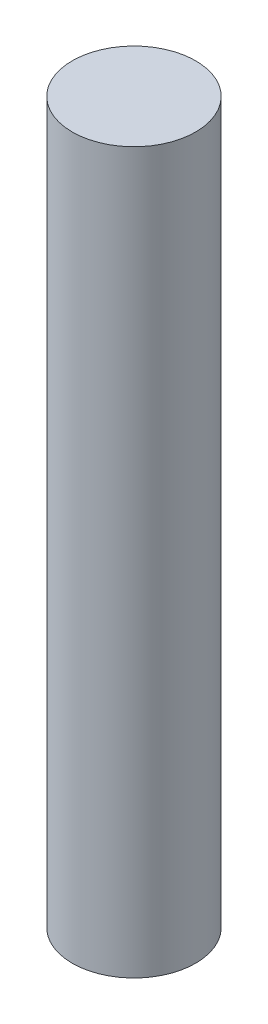
ISO-10303-21;
HEADER;
FILE_DESCRIPTION(('STEP AP214'),'2;1');
FILE_NAME('part.step','',(''),(''),'','','');
FILE_SCHEMA(('AUTOMOTIVE_DESIGN { 1 0 10303 214 1 1 1 1 }'));
ENDSEC;
DATA;
#1=APPLICATION_CONTEXT('core data for automotive mechanical design processes');
#2=APPLICATION_PROTOCOL_DEFINITION('international standard','automotive_design',2000,#1);
#3=PRODUCT_CONTEXT('',#1,'mechanical');
#4=PRODUCT('Part','Part','',(#3));
#5=PRODUCT_RELATED_PRODUCT_CATEGORY('part','',(#4));
#6=PRODUCT_DEFINITION_FORMATION('','',#4);
#7=PRODUCT_DEFINITION_CONTEXT('part definition',#1,'design');
#8=PRODUCT_DEFINITION('design','',#6,#7);
#9=PRODUCT_DEFINITION_SHAPE('','',#8);
#10=(LENGTH_UNIT() NAMED_UNIT(*) SI_UNIT(.MILLI.,.METRE.));
#11=(NAMED_UNIT(*) PLANE_ANGLE_UNIT() SI_UNIT($,.RADIAN.));
#12=(NAMED_UNIT(*) SI_UNIT($,.STERADIAN.) SOLID_ANGLE_UNIT());
#13=UNCERTAINTY_MEASURE_WITH_UNIT(LENGTH_MEASURE(1.E-05),#10,'distance_accuracy_value','');
#14=(GEOMETRIC_REPRESENTATION_CONTEXT(3) GLOBAL_UNCERTAINTY_ASSIGNED_CONTEXT((#13)) GLOBAL_UNIT_ASSIGNED_CONTEXT((#10,
#11,#12)) REPRESENTATION_CONTEXT('',''));
#15=CARTESIAN_POINT('',(0.,0.,0.));
#16=DIRECTION('',(0.,0.,1.));
#17=DIRECTION('',(1.,0.,0.));
#18=AXIS2_PLACEMENT_3D('',#15,#16,#17);
#19=CARTESIAN_POINT('',(0.,35.,0.));
#20=DIRECTION('',(0.,-1.,0.));
#21=DIRECTION('',(0.,0.,-1.));
#22=AXIS2_PLACEMENT_3D('',#19,#20,#21);
#23=CYLINDRICAL_SURFACE('',#22,3.);
#24=CARTESIAN_POINT('',(0.,35.,0.));
#25=DIRECTION('',(0.,1.,0.));
#26=DIRECTION('',(0.,0.,1.));
#27=AXIS2_PLACEMENT_3D('',#24,#25,#26);
#28=CIRCLE('',#27,3.);
#29=CARTESIAN_POINT('',(0.,35.,3.));
#30=VERTEX_POINT('',#29);
#31=EDGE_CURVE('E10',#30,#30,#28,.T.);
#32=ORIENTED_EDGE('',*,*,#31,.F.);
#33=EDGE_LOOP('',(#32));
#34=FACE_BOUND('',#33,.T.);
#35=CARTESIAN_POINT('',(0.,0.,0.));
#36=DIRECTION('',(0.,1.,0.));
#37=DIRECTION('',(0.,0.,1.));
#38=AXIS2_PLACEMENT_3D('',#35,#36,#37);
#39=CIRCLE('',#38,3.);
#40=CARTESIAN_POINT('',(0.,0.,3.));
#41=VERTEX_POINT('',#40);
#42=EDGE_CURVE('E40',#41,#41,#39,.T.);
#43=ORIENTED_EDGE('',*,*,#42,.T.);
#44=EDGE_LOOP('',(#43));
#45=FACE_BOUND('',#44,.T.);
#46=ADVANCED_FACE('F37',(#34,#45),#23,.T.);
#47=CARTESIAN_POINT('',(0.,35.,0.));
#48=DIRECTION('',(0.,1.,0.));
#49=DIRECTION('',(0.,0.,1.));
#50=AXIS2_PLACEMENT_3D('',#47,#48,#49);
#51=PLANE('',#50);
#52=ORIENTED_EDGE('',*,*,#31,.T.);
#53=EDGE_LOOP('',(#52));
#54=FACE_BOUND('',#53,.T.);
#55=ADVANCED_FACE('F52',(#54),#51,.T.);
#56=CARTESIAN_POINT('',(0.,0.,0.));
#57=DIRECTION('',(0.,1.,0.));
#58=DIRECTION('',(0.,0.,1.));
#59=AXIS2_PLACEMENT_3D('',#56,#57,#58);
#60=PLANE('',#59);
#61=ORIENTED_EDGE('',*,*,#42,.F.);
#62=EDGE_LOOP('',(#61));
#63=FACE_BOUND('',#62,.T.);
#64=ADVANCED_FACE('F50',(#63),#60,.F.);
#65=CLOSED_SHELL('',(#46,#55,#64));
#66=MANIFOLD_SOLID_BREP('B2',#65);
#67=ADVANCED_BREP_SHAPE_REPRESENTATION('',(#18,#66),#14);
#68=SHAPE_DEFINITION_REPRESENTATION(#9,#67);
ENDSEC;
END-ISO-10303-21;
